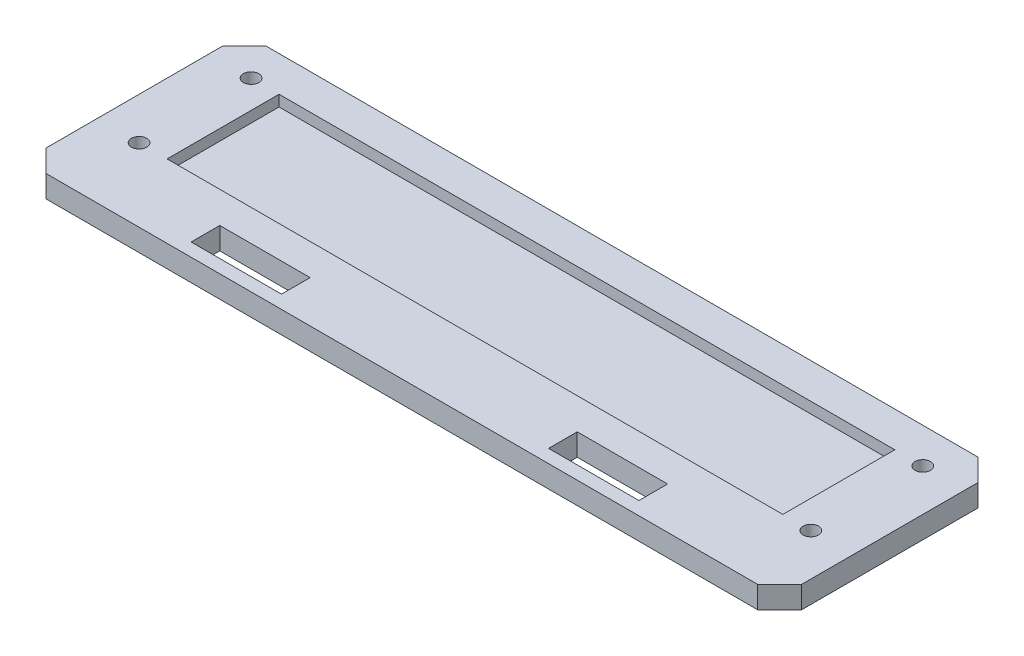
ISO-10303-21;
HEADER;
FILE_DESCRIPTION(('STEP AP214'),'2;1');
FILE_NAME('part.step','',(''),(''),'','','');
FILE_SCHEMA(('AUTOMOTIVE_DESIGN { 1 0 10303 214 1 1 1 1 }'));
ENDSEC;
DATA;
#1=APPLICATION_CONTEXT('core data for automotive mechanical design processes');
#2=APPLICATION_PROTOCOL_DEFINITION('international standard','automotive_design',2000,#1);
#3=PRODUCT_CONTEXT('',#1,'mechanical');
#4=PRODUCT('Part','Part','',(#3));
#5=PRODUCT_RELATED_PRODUCT_CATEGORY('part','',(#4));
#6=PRODUCT_DEFINITION_FORMATION('','',#4);
#7=PRODUCT_DEFINITION_CONTEXT('part definition',#1,'design');
#8=PRODUCT_DEFINITION('design','',#6,#7);
#9=PRODUCT_DEFINITION_SHAPE('','',#8);
#10=(LENGTH_UNIT() NAMED_UNIT(*) SI_UNIT(.MILLI.,.METRE.));
#11=(NAMED_UNIT(*) PLANE_ANGLE_UNIT() SI_UNIT($,.RADIAN.));
#12=(NAMED_UNIT(*) SI_UNIT($,.STERADIAN.) SOLID_ANGLE_UNIT());
#13=UNCERTAINTY_MEASURE_WITH_UNIT(LENGTH_MEASURE(1.E-05),#10,'distance_accuracy_value','');
#14=(GEOMETRIC_REPRESENTATION_CONTEXT(3) GLOBAL_UNCERTAINTY_ASSIGNED_CONTEXT((#13)) GLOBAL_UNIT_ASSIGNED_CONTEXT((#10,
#11,#12)) REPRESENTATION_CONTEXT('',''));
#15=CARTESIAN_POINT('',(0.,0.,0.));
#16=DIRECTION('',(0.,0.,1.));
#17=DIRECTION('',(1.,0.,0.));
#18=AXIS2_PLACEMENT_3D('',#15,#16,#17);
#19=CARTESIAN_POINT('',(0.,5.,0.));
#20=DIRECTION('',(0.,-1.,0.));
#21=DIRECTION('',(0.,0.,-1.));
#22=AXIS2_PLACEMENT_3D('',#19,#20,#21);
#23=PLANE('',#22);
#24=DIRECTION('',(-1.,0.,0.));
#25=VECTOR('',#24,1.);
#26=CARTESIAN_POINT('',(-30.2999999999999,5.,15.5));
#27=LINE('',#26,#25);
#28=CARTESIAN_POINT('',(-30.2999999999999,5.,15.5));
#29=VERTEX_POINT('',#28);
#30=CARTESIAN_POINT('',(-50.7999999999999,5.,15.5));
#31=VERTEX_POINT('',#30);
#32=EDGE_CURVE('E181',#29,#31,#27,.T.);
#33=ORIENTED_EDGE('',*,*,#32,.F.);
#34=DIRECTION('',(0.,0.,-1.));
#35=VECTOR('',#34,1.);
#36=CARTESIAN_POINT('',(-30.2999999999999,5.,22.));
#37=LINE('',#36,#35);
#38=CARTESIAN_POINT('',(-30.2999999999999,5.,22.));
#39=VERTEX_POINT('',#38);
#40=EDGE_CURVE('E48',#39,#29,#37,.T.);
#41=ORIENTED_EDGE('',*,*,#40,.F.);
#42=DIRECTION('',(1.,0.,0.));
#43=VECTOR('',#42,1.);
#44=CARTESIAN_POINT('',(-30.2999999999999,5.,22.));
#45=LINE('',#44,#43);
#46=CARTESIAN_POINT('',(-50.7999999999999,5.,22.));
#47=VERTEX_POINT('',#46);
#48=EDGE_CURVE('E187',#47,#39,#45,.T.);
#49=ORIENTED_EDGE('',*,*,#48,.F.);
#50=DIRECTION('',(0.,0.,1.));
#51=VECTOR('',#50,1.);
#52=CARTESIAN_POINT('',(-50.7999999999999,5.,22.));
#53=LINE('',#52,#51);
#54=EDGE_CURVE('E172',#31,#47,#53,.T.);
#55=ORIENTED_EDGE('',*,*,#54,.F.);
#56=EDGE_LOOP('',(#33,#41,#49,#55));
#57=FACE_BOUND('',#56,.T.);
#58=DIRECTION('',(-1.,0.,0.));
#59=VECTOR('',#58,1.);
#60=CARTESIAN_POINT('',(50.8000000000001,5.,15.5));
#61=LINE('',#60,#59);
#62=CARTESIAN_POINT('',(50.8000000000001,5.,15.5));
#63=VERTEX_POINT('',#62);
#64=CARTESIAN_POINT('',(30.3000000000001,5.,15.5));
#65=VERTEX_POINT('',#64);
#66=EDGE_CURVE('E198',#63,#65,#61,.T.);
#67=ORIENTED_EDGE('',*,*,#66,.F.);
#68=DIRECTION('',(0.,0.,-1.));
#69=VECTOR('',#68,1.);
#70=CARTESIAN_POINT('',(50.8000000000001,5.,22.));
#71=LINE('',#70,#69);
#72=CARTESIAN_POINT('',(50.8000000000001,5.,22.));
#73=VERTEX_POINT('',#72);
#74=EDGE_CURVE('E194',#73,#63,#71,.T.);
#75=ORIENTED_EDGE('',*,*,#74,.F.);
#76=DIRECTION('',(1.,0.,0.));
#77=VECTOR('',#76,1.);
#78=CARTESIAN_POINT('',(50.8000000000001,5.,22.));
#79=LINE('',#78,#77);
#80=CARTESIAN_POINT('',(30.3000000000001,5.,22.));
#81=VERTEX_POINT('',#80);
#82=EDGE_CURVE('E204',#81,#73,#79,.T.);
#83=ORIENTED_EDGE('',*,*,#82,.F.);
#84=DIRECTION('',(0.,0.,1.));
#85=VECTOR('',#84,1.);
#86=CARTESIAN_POINT('',(30.3000000000001,5.,22.));
#87=LINE('',#86,#85);
#88=EDGE_CURVE('E201',#65,#81,#87,.T.);
#89=ORIENTED_EDGE('',*,*,#88,.F.);
#90=EDGE_LOOP('',(#67,#75,#83,#89));
#91=FACE_BOUND('',#90,.T.);
#92=DIRECTION('',(1.,0.,0.));
#93=VECTOR('',#92,1.);
#94=CARTESIAN_POINT('',(-69.85,5.,8.39999999999999));
#95=LINE('',#94,#93);
#96=CARTESIAN_POINT('',(-69.85,5.,8.39999999999999));
#97=VERTEX_POINT('',#96);
#98=CARTESIAN_POINT('',(69.85,5.,8.39999999999999));
#99=VERTEX_POINT('',#98);
#100=EDGE_CURVE('E232',#97,#99,#95,.T.);
#101=ORIENTED_EDGE('',*,*,#100,.F.);
#102=DIRECTION('',(0.,0.,1.));
#103=VECTOR('',#102,1.);
#104=CARTESIAN_POINT('',(-69.85,5.,-17.));
#105=LINE('',#104,#103);
#106=CARTESIAN_POINT('',(-69.85,5.,-17.));
#107=VERTEX_POINT('',#106);
#108=EDGE_CURVE('E210',#107,#97,#105,.T.);
#109=ORIENTED_EDGE('',*,*,#108,.F.);
#110=DIRECTION('',(-1.,0.,0.));
#111=VECTOR('',#110,1.);
#112=CARTESIAN_POINT('',(-69.85,5.,-17.));
#113=LINE('',#112,#111);
#114=CARTESIAN_POINT('',(69.85,5.,-17.));
#115=VERTEX_POINT('',#114);
#116=EDGE_CURVE('E221',#115,#107,#113,.T.);
#117=ORIENTED_EDGE('',*,*,#116,.F.);
#118=DIRECTION('',(0.,0.,-1.));
#119=VECTOR('',#118,1.);
#120=CARTESIAN_POINT('',(69.85,5.,-17.));
#121=LINE('',#120,#119);
#122=EDGE_CURVE('E235',#99,#115,#121,.T.);
#123=ORIENTED_EDGE('',*,*,#122,.F.);
#124=EDGE_LOOP('',(#101,#109,#117,#123));
#125=FACE_BOUND('',#124,.T.);
#126=DIRECTION('',(1.,0.,0.));
#127=VECTOR('',#126,1.);
#128=CARTESIAN_POINT('',(-85.7249999999999,5.,25.));
#129=LINE('',#128,#127);
#130=CARTESIAN_POINT('',(-80.7249999999999,5.,25.));
#131=VERTEX_POINT('',#130);
#132=CARTESIAN_POINT('',(80.725,5.,25.));
#133=VERTEX_POINT('',#132);
#134=EDGE_CURVE('E283',#131,#133,#129,.T.);
#135=ORIENTED_EDGE('',*,*,#134,.T.);
#136=DIRECTION('',(-0.707106781186548,0.,0.707106781186548));
#137=VECTOR('',#136,1.);
#138=CARTESIAN_POINT('',(85.7250000000001,5.,20.));
#139=LINE('',#138,#137);
#140=CARTESIAN_POINT('',(85.7250000000001,5.,20.));
#141=VERTEX_POINT('',#140);
#142=EDGE_CURVE('E320',#133,#141,#139,.F.);
#143=ORIENTED_EDGE('',*,*,#142,.T.);
#144=DIRECTION('',(0.,0.,-1.));
#145=VECTOR('',#144,1.);
#146=CARTESIAN_POINT('',(85.7250000000001,5.,25.));
#147=LINE('',#146,#145);
#148=CARTESIAN_POINT('',(85.7250000000001,5.,-20.));
#149=VERTEX_POINT('',#148);
#150=EDGE_CURVE('E273',#141,#149,#147,.T.);
#151=ORIENTED_EDGE('',*,*,#150,.T.);
#152=DIRECTION('',(0.707106781186548,0.,0.707106781186548));
#153=VECTOR('',#152,1.);
#154=CARTESIAN_POINT('',(80.725,5.,-25.));
#155=LINE('',#154,#153);
#156=CARTESIAN_POINT('',(80.725,5.,-25.));
#157=VERTEX_POINT('',#156);
#158=EDGE_CURVE('E314',#149,#157,#155,.F.);
#159=ORIENTED_EDGE('',*,*,#158,.T.);
#160=DIRECTION('',(-1.,0.,0.));
#161=VECTOR('',#160,1.);
#162=CARTESIAN_POINT('',(-85.7249999999999,5.,-25.));
#163=LINE('',#162,#161);
#164=CARTESIAN_POINT('',(-80.7249999999999,5.,-25.));
#165=VERTEX_POINT('',#164);
#166=EDGE_CURVE('E276',#157,#165,#163,.T.);
#167=ORIENTED_EDGE('',*,*,#166,.T.);
#168=DIRECTION('',(0.707106781186548,0.,-0.707106781186548));
#169=VECTOR('',#168,1.);
#170=CARTESIAN_POINT('',(-85.7249999999999,5.,-20.));
#171=LINE('',#170,#169);
#172=CARTESIAN_POINT('',(-85.7249999999999,5.,-20.));
#173=VERTEX_POINT('',#172);
#174=EDGE_CURVE('E316',#165,#173,#171,.F.);
#175=ORIENTED_EDGE('',*,*,#174,.T.);
#176=DIRECTION('',(0.,0.,1.));
#177=VECTOR('',#176,1.);
#178=CARTESIAN_POINT('',(-85.7249999999999,5.,25.));
#179=LINE('',#178,#177);
#180=CARTESIAN_POINT('',(-85.7249999999999,5.,20.));
#181=VERTEX_POINT('',#180);
#182=EDGE_CURVE('E280',#173,#181,#179,.T.);
#183=ORIENTED_EDGE('',*,*,#182,.T.);
#184=DIRECTION('',(-0.707106781186548,0.,-0.707106781186548));
#185=VECTOR('',#184,1.);
#186=CARTESIAN_POINT('',(-80.7249999999999,5.,25.));
#187=LINE('',#186,#185);
#188=EDGE_CURVE('E318',#181,#131,#187,.F.);
#189=ORIENTED_EDGE('',*,*,#188,.T.);
#190=EDGE_LOOP('',(#135,#143,#151,#159,#167,#175,#183,#189));
#191=FACE_BOUND('',#190,.T.);
#192=CARTESIAN_POINT('',(-76.2,5.,-17.));
#193=DIRECTION('',(0.,1.,0.));
#194=DIRECTION('',(0.,0.,1.));
#195=AXIS2_PLACEMENT_3D('',#192,#193,#194);
#196=CIRCLE('',#195,1.75);
#197=CARTESIAN_POINT('',(-76.2,5.,-15.25));
#198=VERTEX_POINT('',#197);
#199=EDGE_CURVE('E267',#198,#198,#196,.T.);
#200=ORIENTED_EDGE('',*,*,#199,.F.);
#201=EDGE_LOOP('',(#200));
#202=FACE_BOUND('',#201,.T.);
#203=CARTESIAN_POINT('',(76.2,5.,-17.));
#204=DIRECTION('',(0.,1.,0.));
#205=DIRECTION('',(0.,0.,1.));
#206=AXIS2_PLACEMENT_3D('',#203,#204,#205);
#207=CIRCLE('',#206,1.75);
#208=CARTESIAN_POINT('',(76.2,5.,-15.25));
#209=VERTEX_POINT('',#208);
#210=EDGE_CURVE('E261',#209,#209,#207,.T.);
#211=ORIENTED_EDGE('',*,*,#210,.F.);
#212=EDGE_LOOP('',(#211));
#213=FACE_BOUND('',#212,.T.);
#214=CARTESIAN_POINT('',(-76.2,5.,8.39999999999999));
#215=DIRECTION('',(0.,1.,0.));
#216=DIRECTION('',(0.,0.,1.));
#217=AXIS2_PLACEMENT_3D('',#214,#215,#216);
#218=CIRCLE('',#217,1.75);
#219=CARTESIAN_POINT('',(-76.2,5.,10.15));
#220=VERTEX_POINT('',#219);
#221=EDGE_CURVE('E255',#220,#220,#218,.T.);
#222=ORIENTED_EDGE('',*,*,#221,.F.);
#223=EDGE_LOOP('',(#222));
#224=FACE_BOUND('',#223,.T.);
#225=CARTESIAN_POINT('',(76.2,5.,8.39999999999999));
#226=DIRECTION('',(0.,1.,0.));
#227=DIRECTION('',(0.,0.,1.));
#228=AXIS2_PLACEMENT_3D('',#225,#226,#227);
#229=CIRCLE('',#228,1.75);
#230=CARTESIAN_POINT('',(76.2,5.,10.15));
#231=VERTEX_POINT('',#230);
#232=EDGE_CURVE('E249',#231,#231,#229,.T.);
#233=ORIENTED_EDGE('',*,*,#232,.F.);
#234=EDGE_LOOP('',(#233));
#235=FACE_BOUND('',#234,.T.);
#236=ADVANCED_FACE('F33',(#57,#91,#125,#191,#202,#213,#224,#235),#23,.F.);
#237=CARTESIAN_POINT('',(0.,0.,0.));
#238=DIRECTION('',(0.,-1.,0.));
#239=DIRECTION('',(0.,0.,-1.));
#240=AXIS2_PLACEMENT_3D('',#237,#238,#239);
#241=PLANE('',#240);
#242=DIRECTION('',(0.,0.,1.));
#243=VECTOR('',#242,1.);
#244=CARTESIAN_POINT('',(-30.2999999999999,0.,0.));
#245=LINE('',#244,#243);
#246=CARTESIAN_POINT('',(-30.2999999999999,0.,15.5));
#247=VERTEX_POINT('',#246);
#248=CARTESIAN_POINT('',(-30.2999999999999,0.,22.));
#249=VERTEX_POINT('',#248);
#250=EDGE_CURVE('E11',#247,#249,#245,.T.);
#251=ORIENTED_EDGE('',*,*,#250,.F.);
#252=DIRECTION('',(1.,0.,0.));
#253=VECTOR('',#252,1.);
#254=CARTESIAN_POINT('',(0.,0.,15.5));
#255=LINE('',#254,#253);
#256=CARTESIAN_POINT('',(-50.7999999999999,0.,15.5));
#257=VERTEX_POINT('',#256);
#258=EDGE_CURVE('E341',#257,#247,#255,.T.);
#259=ORIENTED_EDGE('',*,*,#258,.F.);
#260=DIRECTION('',(0.,0.,-1.));
#261=VECTOR('',#260,1.);
#262=CARTESIAN_POINT('',(-50.7999999999999,0.,0.));
#263=LINE('',#262,#261);
#264=CARTESIAN_POINT('',(-50.7999999999999,0.,22.));
#265=VERTEX_POINT('',#264);
#266=EDGE_CURVE('E175',#265,#257,#263,.T.);
#267=ORIENTED_EDGE('',*,*,#266,.F.);
#268=DIRECTION('',(-1.,0.,0.));
#269=VECTOR('',#268,1.);
#270=CARTESIAN_POINT('',(0.,0.,22.));
#271=LINE('',#270,#269);
#272=EDGE_CURVE('E41',#249,#265,#271,.T.);
#273=ORIENTED_EDGE('',*,*,#272,.F.);
#274=EDGE_LOOP('',(#251,#259,#267,#273));
#275=FACE_BOUND('',#274,.T.);
#276=DIRECTION('',(0.,0.,1.));
#277=VECTOR('',#276,1.);
#278=CARTESIAN_POINT('',(50.8000000000001,0.,0.));
#279=LINE('',#278,#277);
#280=CARTESIAN_POINT('',(50.8000000000001,0.,15.5));
#281=VERTEX_POINT('',#280);
#282=CARTESIAN_POINT('',(50.8000000000001,0.,22.));
#283=VERTEX_POINT('',#282);
#284=EDGE_CURVE('E339',#281,#283,#279,.T.);
#285=ORIENTED_EDGE('',*,*,#284,.F.);
#286=DIRECTION('',(1.,0.,0.));
#287=VECTOR('',#286,1.);
#288=CARTESIAN_POINT('',(0.,0.,15.5));
#289=LINE('',#288,#287);
#290=CARTESIAN_POINT('',(30.3000000000001,0.,15.5));
#291=VERTEX_POINT('',#290);
#292=EDGE_CURVE('E332',#291,#281,#289,.T.);
#293=ORIENTED_EDGE('',*,*,#292,.F.);
#294=DIRECTION('',(0.,0.,-1.));
#295=VECTOR('',#294,1.);
#296=CARTESIAN_POINT('',(30.3000000000001,0.,0.));
#297=LINE('',#296,#295);
#298=CARTESIAN_POINT('',(30.3000000000001,0.,22.));
#299=VERTEX_POINT('',#298);
#300=EDGE_CURVE('E334',#299,#291,#297,.T.);
#301=ORIENTED_EDGE('',*,*,#300,.F.);
#302=DIRECTION('',(-1.,0.,0.));
#303=VECTOR('',#302,1.);
#304=CARTESIAN_POINT('',(0.,0.,22.));
#305=LINE('',#304,#303);
#306=EDGE_CURVE('E337',#283,#299,#305,.T.);
#307=ORIENTED_EDGE('',*,*,#306,.F.);
#308=EDGE_LOOP('',(#285,#293,#301,#307));
#309=FACE_BOUND('',#308,.T.);
#310=CARTESIAN_POINT('',(-76.2,0.,8.39999999999999));
#311=DIRECTION('',(0.,1.,0.));
#312=DIRECTION('',(0.,0.,1.));
#313=AXIS2_PLACEMENT_3D('',#310,#311,#312);
#314=CIRCLE('',#313,1.75);
#315=CARTESIAN_POINT('',(-76.2,0.,10.15));
#316=VERTEX_POINT('',#315);
#317=EDGE_CURVE('E252',#316,#316,#314,.T.);
#318=ORIENTED_EDGE('',*,*,#317,.T.);
#319=EDGE_LOOP('',(#318));
#320=FACE_BOUND('',#319,.T.);
#321=CARTESIAN_POINT('',(-76.2,0.,-17.));
#322=DIRECTION('',(0.,1.,0.));
#323=DIRECTION('',(0.,0.,1.));
#324=AXIS2_PLACEMENT_3D('',#321,#322,#323);
#325=CIRCLE('',#324,1.75);
#326=CARTESIAN_POINT('',(-76.2,0.,-15.25));
#327=VERTEX_POINT('',#326);
#328=EDGE_CURVE('E264',#327,#327,#325,.T.);
#329=ORIENTED_EDGE('',*,*,#328,.T.);
#330=EDGE_LOOP('',(#329));
#331=FACE_BOUND('',#330,.T.);
#332=DIRECTION('',(0.,0.,-1.));
#333=VECTOR('',#332,1.);
#334=CARTESIAN_POINT('',(85.7250000000001,0.,25.));
#335=LINE('',#334,#333);
#336=CARTESIAN_POINT('',(85.7250000000001,0.,20.));
#337=VERTEX_POINT('',#336);
#338=CARTESIAN_POINT('',(85.7250000000001,0.,-20.));
#339=VERTEX_POINT('',#338);
#340=EDGE_CURVE('E270',#337,#339,#335,.T.);
#341=ORIENTED_EDGE('',*,*,#340,.F.);
#342=DIRECTION('',(0.707106781186548,0.,-0.707106781186548));
#343=VECTOR('',#342,1.);
#344=CARTESIAN_POINT('',(52.8625,0.,52.8625));
#345=LINE('',#344,#343);
#346=CARTESIAN_POINT('',(80.725,0.,25.));
#347=VERTEX_POINT('',#346);
#348=EDGE_CURVE('E307',#337,#347,#345,.F.);
#349=ORIENTED_EDGE('',*,*,#348,.T.);
#350=DIRECTION('',(1.,0.,0.));
#351=VECTOR('',#350,1.);
#352=CARTESIAN_POINT('',(-85.7249999999999,0.,25.));
#353=LINE('',#352,#351);
#354=CARTESIAN_POINT('',(-80.7249999999999,0.,25.));
#355=VERTEX_POINT('',#354);
#356=EDGE_CURVE('E277',#355,#347,#353,.T.);
#357=ORIENTED_EDGE('',*,*,#356,.F.);
#358=DIRECTION('',(0.707106781186548,0.,0.707106781186548));
#359=VECTOR('',#358,1.);
#360=CARTESIAN_POINT('',(-52.8625,0.,52.8625));
#361=LINE('',#360,#359);
#362=CARTESIAN_POINT('',(-85.7249999999999,0.,20.));
#363=VERTEX_POINT('',#362);
#364=EDGE_CURVE('E305',#355,#363,#361,.F.);
#365=ORIENTED_EDGE('',*,*,#364,.T.);
#366=DIRECTION('',(0.,0.,1.));
#367=VECTOR('',#366,1.);
#368=CARTESIAN_POINT('',(-85.7249999999999,0.,25.));
#369=LINE('',#368,#367);
#370=CARTESIAN_POINT('',(-85.7249999999999,0.,-20.));
#371=VERTEX_POINT('',#370);
#372=EDGE_CURVE('E292',#371,#363,#369,.T.);
#373=ORIENTED_EDGE('',*,*,#372,.F.);
#374=DIRECTION('',(-0.707106781186548,0.,0.707106781186548));
#375=VECTOR('',#374,1.);
#376=CARTESIAN_POINT('',(-52.8625,0.,-52.8625));
#377=LINE('',#376,#375);
#378=CARTESIAN_POINT('',(-80.7249999999999,0.,-25.));
#379=VERTEX_POINT('',#378);
#380=EDGE_CURVE('E303',#371,#379,#377,.F.);
#381=ORIENTED_EDGE('',*,*,#380,.T.);
#382=DIRECTION('',(-1.,0.,0.));
#383=VECTOR('',#382,1.);
#384=CARTESIAN_POINT('',(-85.7249999999999,0.,-25.));
#385=LINE('',#384,#383);
#386=CARTESIAN_POINT('',(80.725,0.,-25.));
#387=VERTEX_POINT('',#386);
#388=EDGE_CURVE('E289',#387,#379,#385,.T.);
#389=ORIENTED_EDGE('',*,*,#388,.F.);
#390=DIRECTION('',(-0.707106781186548,0.,-0.707106781186548));
#391=VECTOR('',#390,1.);
#392=CARTESIAN_POINT('',(52.8625,0.,-52.8625));
#393=LINE('',#392,#391);
#394=EDGE_CURVE('E301',#387,#339,#393,.F.);
#395=ORIENTED_EDGE('',*,*,#394,.T.);
#396=EDGE_LOOP('',(#341,#349,#357,#365,#373,#381,#389,#395));
#397=FACE_BOUND('',#396,.T.);
#398=CARTESIAN_POINT('',(76.2,0.,-17.));
#399=DIRECTION('',(0.,1.,0.));
#400=DIRECTION('',(0.,0.,1.));
#401=AXIS2_PLACEMENT_3D('',#398,#399,#400);
#402=CIRCLE('',#401,1.75);
#403=CARTESIAN_POINT('',(76.2,0.,-15.25));
#404=VERTEX_POINT('',#403);
#405=EDGE_CURVE('E258',#404,#404,#402,.T.);
#406=ORIENTED_EDGE('',*,*,#405,.T.);
#407=EDGE_LOOP('',(#406));
#408=FACE_BOUND('',#407,.T.);
#409=CARTESIAN_POINT('',(76.2,0.,8.39999999999999));
#410=DIRECTION('',(0.,1.,0.));
#411=DIRECTION('',(0.,0.,1.));
#412=AXIS2_PLACEMENT_3D('',#409,#410,#411);
#413=CIRCLE('',#412,1.75);
#414=CARTESIAN_POINT('',(76.2,0.,10.15));
#415=VERTEX_POINT('',#414);
#416=EDGE_CURVE('E242',#415,#415,#413,.T.);
#417=ORIENTED_EDGE('',*,*,#416,.T.);
#418=EDGE_LOOP('',(#417));
#419=FACE_BOUND('',#418,.T.);
#420=ADVANCED_FACE('F349',(#275,#309,#320,#331,#397,#408,#419),#241,.T.);
#421=CARTESIAN_POINT('',(85.7250000000001,5.,25.));
#422=DIRECTION('',(-1.,0.,0.));
#423=DIRECTION('',(0.,0.,1.));
#424=AXIS2_PLACEMENT_3D('',#421,#422,#423);
#425=PLANE('',#424);
#426=ORIENTED_EDGE('',*,*,#150,.F.);
#427=DIRECTION('',(0.,-1.,0.));
#428=VECTOR('',#427,1.);
#429=CARTESIAN_POINT('',(85.7250000000001,5.,20.));
#430=LINE('',#429,#428);
#431=EDGE_CURVE('E298',#141,#337,#430,.T.);
#432=ORIENTED_EDGE('',*,*,#431,.T.);
#433=ORIENTED_EDGE('',*,*,#340,.T.);
#434=DIRECTION('',(0.,1.,0.));
#435=VECTOR('',#434,1.);
#436=CARTESIAN_POINT('',(85.7250000000001,5.,-20.));
#437=LINE('',#436,#435);
#438=EDGE_CURVE('E286',#339,#149,#437,.T.);
#439=ORIENTED_EDGE('',*,*,#438,.T.);
#440=EDGE_LOOP('',(#426,#432,#433,#439));
#441=FACE_BOUND('',#440,.T.);
#442=ADVANCED_FACE('F370',(#441),#425,.F.);
#443=CARTESIAN_POINT('',(-85.7249999999999,5.,-25.));
#444=DIRECTION('',(0.,0.,1.));
#445=DIRECTION('',(1.,0.,0.));
#446=AXIS2_PLACEMENT_3D('',#443,#444,#445);
#447=PLANE('',#446);
#448=ORIENTED_EDGE('',*,*,#388,.T.);
#449=DIRECTION('',(0.,1.,0.));
#450=VECTOR('',#449,1.);
#451=CARTESIAN_POINT('',(-80.7249999999999,5.,-25.));
#452=LINE('',#451,#450);
#453=EDGE_CURVE('E330',#379,#165,#452,.T.);
#454=ORIENTED_EDGE('',*,*,#453,.T.);
#455=ORIENTED_EDGE('',*,*,#166,.F.);
#456=DIRECTION('',(0.,-1.,0.));
#457=VECTOR('',#456,1.);
#458=CARTESIAN_POINT('',(80.725,5.,-25.));
#459=LINE('',#458,#457);
#460=EDGE_CURVE('E327',#157,#387,#459,.T.);
#461=ORIENTED_EDGE('',*,*,#460,.T.);
#462=EDGE_LOOP('',(#448,#454,#455,#461));
#463=FACE_BOUND('',#462,.T.);
#464=ADVANCED_FACE('F383',(#463),#447,.F.);
#465=CARTESIAN_POINT('',(-85.7249999999999,5.,25.));
#466=DIRECTION('',(1.,0.,0.));
#467=DIRECTION('',(0.,0.,-1.));
#468=AXIS2_PLACEMENT_3D('',#465,#466,#467);
#469=PLANE('',#468);
#470=ORIENTED_EDGE('',*,*,#372,.T.);
#471=DIRECTION('',(0.,1.,0.));
#472=VECTOR('',#471,1.);
#473=CARTESIAN_POINT('',(-85.7249999999999,5.,20.));
#474=LINE('',#473,#472);
#475=EDGE_CURVE('E325',#363,#181,#474,.T.);
#476=ORIENTED_EDGE('',*,*,#475,.T.);
#477=ORIENTED_EDGE('',*,*,#182,.F.);
#478=DIRECTION('',(0.,-1.,0.));
#479=VECTOR('',#478,1.);
#480=CARTESIAN_POINT('',(-85.7249999999999,5.,-20.));
#481=LINE('',#480,#479);
#482=EDGE_CURVE('E322',#173,#371,#481,.T.);
#483=ORIENTED_EDGE('',*,*,#482,.T.);
#484=EDGE_LOOP('',(#470,#476,#477,#483));
#485=FACE_BOUND('',#484,.T.);
#486=ADVANCED_FACE('F379',(#485),#469,.F.);
#487=CARTESIAN_POINT('',(-85.7249999999999,5.,25.));
#488=DIRECTION('',(0.,0.,-1.));
#489=DIRECTION('',(-1.,0.,0.));
#490=AXIS2_PLACEMENT_3D('',#487,#488,#489);
#491=PLANE('',#490);
#492=ORIENTED_EDGE('',*,*,#356,.T.);
#493=DIRECTION('',(0.,1.,0.));
#494=VECTOR('',#493,1.);
#495=CARTESIAN_POINT('',(80.725,5.,25.));
#496=LINE('',#495,#494);
#497=EDGE_CURVE('E312',#347,#133,#496,.T.);
#498=ORIENTED_EDGE('',*,*,#497,.T.);
#499=ORIENTED_EDGE('',*,*,#134,.F.);
#500=DIRECTION('',(0.,-1.,0.));
#501=VECTOR('',#500,1.);
#502=CARTESIAN_POINT('',(-80.7249999999999,5.,25.));
#503=LINE('',#502,#501);
#504=EDGE_CURVE('E309',#131,#355,#503,.T.);
#505=ORIENTED_EDGE('',*,*,#504,.T.);
#506=EDGE_LOOP('',(#492,#498,#499,#505));
#507=FACE_BOUND('',#506,.T.);
#508=ADVANCED_FACE('F376',(#507),#491,.F.);
#509=CARTESIAN_POINT('',(-76.2,5.,-17.));
#510=DIRECTION('',(0.,-1.,0.));
#511=DIRECTION('',(0.,0.,-1.));
#512=AXIS2_PLACEMENT_3D('',#509,#510,#511);
#513=CYLINDRICAL_SURFACE('',#512,1.75);
#514=ORIENTED_EDGE('',*,*,#199,.T.);
#515=EDGE_LOOP('',(#514));
#516=FACE_BOUND('',#515,.T.);
#517=ORIENTED_EDGE('',*,*,#328,.F.);
#518=EDGE_LOOP('',(#517));
#519=FACE_BOUND('',#518,.T.);
#520=ADVANCED_FACE('F373',(#516,#519),#513,.F.);
#521=CARTESIAN_POINT('',(76.2,5.,-17.));
#522=DIRECTION('',(0.,-1.,0.));
#523=DIRECTION('',(0.,0.,-1.));
#524=AXIS2_PLACEMENT_3D('',#521,#522,#523);
#525=CYLINDRICAL_SURFACE('',#524,1.75);
#526=ORIENTED_EDGE('',*,*,#210,.T.);
#527=EDGE_LOOP('',(#526));
#528=FACE_BOUND('',#527,.T.);
#529=ORIENTED_EDGE('',*,*,#405,.F.);
#530=EDGE_LOOP('',(#529));
#531=FACE_BOUND('',#530,.T.);
#532=ADVANCED_FACE('F442',(#528,#531),#525,.F.);
#533=CARTESIAN_POINT('',(-76.2,5.,8.39999999999999));
#534=DIRECTION('',(0.,-1.,0.));
#535=DIRECTION('',(0.,0.,-1.));
#536=AXIS2_PLACEMENT_3D('',#533,#534,#535);
#537=CYLINDRICAL_SURFACE('',#536,1.75);
#538=ORIENTED_EDGE('',*,*,#221,.T.);
#539=EDGE_LOOP('',(#538));
#540=FACE_BOUND('',#539,.T.);
#541=ORIENTED_EDGE('',*,*,#317,.F.);
#542=EDGE_LOOP('',(#541));
#543=FACE_BOUND('',#542,.T.);
#544=ADVANCED_FACE('F436',(#540,#543),#537,.F.);
#545=CARTESIAN_POINT('',(76.2,5.,8.39999999999999));
#546=DIRECTION('',(0.,-1.,0.));
#547=DIRECTION('',(0.,0.,-1.));
#548=AXIS2_PLACEMENT_3D('',#545,#546,#547);
#549=CYLINDRICAL_SURFACE('',#548,1.75);
#550=ORIENTED_EDGE('',*,*,#232,.T.);
#551=EDGE_LOOP('',(#550));
#552=FACE_BOUND('',#551,.T.);
#553=ORIENTED_EDGE('',*,*,#416,.F.);
#554=EDGE_LOOP('',(#553));
#555=FACE_BOUND('',#554,.T.);
#556=ADVANCED_FACE('F395',(#552,#555),#549,.F.);
#557=CARTESIAN_POINT('',(85.7250000000001,5.,20.));
#558=DIRECTION('',(-0.707106781186547,0.,-0.707106781186547));
#559=DIRECTION('',(0.,-1.,0.));
#560=AXIS2_PLACEMENT_3D('',#557,#558,#559);
#561=PLANE('',#560);
#562=ORIENTED_EDGE('',*,*,#142,.F.);
#563=ORIENTED_EDGE('',*,*,#497,.F.);
#564=ORIENTED_EDGE('',*,*,#348,.F.);
#565=ORIENTED_EDGE('',*,*,#431,.F.);
#566=EDGE_LOOP('',(#562,#563,#564,#565));
#567=FACE_BOUND('',#566,.T.);
#568=ADVANCED_FACE('F391',(#567),#561,.F.);
#569=CARTESIAN_POINT('',(-80.7249999999999,5.,25.));
#570=DIRECTION('',(0.707106781186547,0.,-0.707106781186547));
#571=DIRECTION('',(0.,-1.,0.));
#572=AXIS2_PLACEMENT_3D('',#569,#570,#571);
#573=PLANE('',#572);
#574=ORIENTED_EDGE('',*,*,#188,.F.);
#575=ORIENTED_EDGE('',*,*,#475,.F.);
#576=ORIENTED_EDGE('',*,*,#364,.F.);
#577=ORIENTED_EDGE('',*,*,#504,.F.);
#578=EDGE_LOOP('',(#574,#575,#576,#577));
#579=FACE_BOUND('',#578,.T.);
#580=ADVANCED_FACE('F394',(#579),#573,.F.);
#581=CARTESIAN_POINT('',(-85.7249999999999,5.,-20.));
#582=DIRECTION('',(0.707106781186547,0.,0.707106781186547));
#583=DIRECTION('',(0.,-1.,0.));
#584=AXIS2_PLACEMENT_3D('',#581,#582,#583);
#585=PLANE('',#584);
#586=ORIENTED_EDGE('',*,*,#174,.F.);
#587=ORIENTED_EDGE('',*,*,#453,.F.);
#588=ORIENTED_EDGE('',*,*,#380,.F.);
#589=ORIENTED_EDGE('',*,*,#482,.F.);
#590=EDGE_LOOP('',(#586,#587,#588,#589));
#591=FACE_BOUND('',#590,.T.);
#592=ADVANCED_FACE('F398',(#591),#585,.F.);
#593=CARTESIAN_POINT('',(80.725,5.,-25.));
#594=DIRECTION('',(-0.707106781186547,0.,0.707106781186547));
#595=DIRECTION('',(0.,-1.,0.));
#596=AXIS2_PLACEMENT_3D('',#593,#594,#595);
#597=PLANE('',#596);
#598=ORIENTED_EDGE('',*,*,#158,.F.);
#599=ORIENTED_EDGE('',*,*,#438,.F.);
#600=ORIENTED_EDGE('',*,*,#394,.F.);
#601=ORIENTED_EDGE('',*,*,#460,.F.);
#602=EDGE_LOOP('',(#598,#599,#600,#601));
#603=FACE_BOUND('',#602,.T.);
#604=ADVANCED_FACE('F35',(#603),#597,.F.);
#605=CARTESIAN_POINT('',(-69.85,2.5,-17.));
#606=DIRECTION('',(-1.,0.,0.));
#607=DIRECTION('',(0.,0.,1.));
#608=AXIS2_PLACEMENT_3D('',#605,#606,#607);
#609=PLANE('',#608);
#610=ORIENTED_EDGE('',*,*,#108,.T.);
#611=DIRECTION('',(0.,1.,0.));
#612=VECTOR('',#611,1.);
#613=CARTESIAN_POINT('',(-69.85,2.5,8.39999999999999));
#614=LINE('',#613,#612);
#615=CARTESIAN_POINT('',(-69.85,2.5,8.39999999999999));
#616=VERTEX_POINT('',#615);
#617=EDGE_CURVE('E230',#616,#97,#614,.T.);
#618=ORIENTED_EDGE('',*,*,#617,.F.);
#619=DIRECTION('',(0.,0.,1.));
#620=VECTOR('',#619,1.);
#621=CARTESIAN_POINT('',(-69.85,2.5,-17.));
#622=LINE('',#621,#620);
#623=CARTESIAN_POINT('',(-69.85,2.5,-17.));
#624=VERTEX_POINT('',#623);
#625=EDGE_CURVE('E217',#624,#616,#622,.T.);
#626=ORIENTED_EDGE('',*,*,#625,.F.);
#627=DIRECTION('',(0.,1.,0.));
#628=VECTOR('',#627,1.);
#629=CARTESIAN_POINT('',(-69.85,2.5,-17.));
#630=LINE('',#629,#628);
#631=EDGE_CURVE('E240',#624,#107,#630,.T.);
#632=ORIENTED_EDGE('',*,*,#631,.T.);
#633=EDGE_LOOP('',(#610,#618,#626,#632));
#634=FACE_BOUND('',#633,.T.);
#635=ADVANCED_FACE('F405',(#634),#609,.F.);
#636=CARTESIAN_POINT('',(-69.85,2.5,-17.));
#637=DIRECTION('',(0.,0.,-1.));
#638=DIRECTION('',(-1.,0.,0.));
#639=AXIS2_PLACEMENT_3D('',#636,#637,#638);
#640=PLANE('',#639);
#641=ORIENTED_EDGE('',*,*,#116,.T.);
#642=ORIENTED_EDGE('',*,*,#631,.F.);
#643=DIRECTION('',(-1.,0.,0.));
#644=VECTOR('',#643,1.);
#645=CARTESIAN_POINT('',(-69.85,2.5,-17.));
#646=LINE('',#645,#644);
#647=CARTESIAN_POINT('',(69.85,2.5,-17.));
#648=VERTEX_POINT('',#647);
#649=EDGE_CURVE('E227',#648,#624,#646,.T.);
#650=ORIENTED_EDGE('',*,*,#649,.F.);
#651=DIRECTION('',(0.,1.,0.));
#652=VECTOR('',#651,1.);
#653=CARTESIAN_POINT('',(69.85,2.5,-17.));
#654=LINE('',#653,#652);
#655=EDGE_CURVE('E243',#648,#115,#654,.T.);
#656=ORIENTED_EDGE('',*,*,#655,.T.);
#657=EDGE_LOOP('',(#641,#642,#650,#656));
#658=FACE_BOUND('',#657,.T.);
#659=ADVANCED_FACE('F563',(#658),#640,.F.);
#660=CARTESIAN_POINT('',(69.85,2.5,-17.));
#661=DIRECTION('',(1.,0.,0.));
#662=DIRECTION('',(0.,0.,-1.));
#663=AXIS2_PLACEMENT_3D('',#660,#661,#662);
#664=PLANE('',#663);
#665=ORIENTED_EDGE('',*,*,#122,.T.);
#666=ORIENTED_EDGE('',*,*,#655,.F.);
#667=DIRECTION('',(0.,0.,-1.));
#668=VECTOR('',#667,1.);
#669=CARTESIAN_POINT('',(69.85,2.5,-17.));
#670=LINE('',#669,#668);
#671=CARTESIAN_POINT('',(69.85,2.5,8.39999999999999));
#672=VERTEX_POINT('',#671);
#673=EDGE_CURVE('E224',#672,#648,#670,.T.);
#674=ORIENTED_EDGE('',*,*,#673,.F.);
#675=DIRECTION('',(0.,1.,0.));
#676=VECTOR('',#675,1.);
#677=CARTESIAN_POINT('',(69.85,2.5,8.39999999999999));
#678=LINE('',#677,#676);
#679=EDGE_CURVE('E245',#672,#99,#678,.T.);
#680=ORIENTED_EDGE('',*,*,#679,.T.);
#681=EDGE_LOOP('',(#665,#666,#674,#680));
#682=FACE_BOUND('',#681,.T.);
#683=ADVANCED_FACE('F566',(#682),#664,.F.);
#684=CARTESIAN_POINT('',(-69.85,2.5,8.39999999999999));
#685=DIRECTION('',(0.,0.,1.));
#686=DIRECTION('',(1.,0.,0.));
#687=AXIS2_PLACEMENT_3D('',#684,#685,#686);
#688=PLANE('',#687);
#689=ORIENTED_EDGE('',*,*,#100,.T.);
#690=ORIENTED_EDGE('',*,*,#679,.F.);
#691=DIRECTION('',(1.,0.,0.));
#692=VECTOR('',#691,1.);
#693=CARTESIAN_POINT('',(-69.85,2.5,8.39999999999999));
#694=LINE('',#693,#692);
#695=EDGE_CURVE('E220',#616,#672,#694,.T.);
#696=ORIENTED_EDGE('',*,*,#695,.F.);
#697=ORIENTED_EDGE('',*,*,#617,.T.);
#698=EDGE_LOOP('',(#689,#690,#696,#697));
#699=FACE_BOUND('',#698,.T.);
#700=ADVANCED_FACE('F561',(#699),#688,.F.);
#701=CARTESIAN_POINT('',(0.,2.5,0.));
#702=DIRECTION('',(0.,1.,0.));
#703=DIRECTION('',(0.,0.,1.));
#704=AXIS2_PLACEMENT_3D('',#701,#702,#703);
#705=PLANE('',#704);
#706=ORIENTED_EDGE('',*,*,#625,.T.);
#707=ORIENTED_EDGE('',*,*,#695,.T.);
#708=ORIENTED_EDGE('',*,*,#673,.T.);
#709=ORIENTED_EDGE('',*,*,#649,.T.);
#710=EDGE_LOOP('',(#706,#707,#708,#709));
#711=FACE_BOUND('',#710,.T.);
#712=ADVANCED_FACE('F504',(#711),#705,.T.);
#713=CARTESIAN_POINT('',(50.8000000000001,-10.,22.));
#714=DIRECTION('',(1.,0.,0.));
#715=DIRECTION('',(0.,0.,-1.));
#716=AXIS2_PLACEMENT_3D('',#713,#714,#715);
#717=PLANE('',#716);
#718=ORIENTED_EDGE('',*,*,#284,.T.);
#719=DIRECTION('',(0.,1.,0.));
#720=VECTOR('',#719,1.);
#721=CARTESIAN_POINT('',(50.8000000000001,-10.,22.));
#722=LINE('',#721,#720);
#723=EDGE_CURVE('E208',#283,#73,#722,.T.);
#724=ORIENTED_EDGE('',*,*,#723,.T.);
#725=ORIENTED_EDGE('',*,*,#74,.T.);
#726=DIRECTION('',(0.,1.,0.));
#727=VECTOR('',#726,1.);
#728=CARTESIAN_POINT('',(50.8000000000001,-10.,15.5));
#729=LINE('',#728,#727);
#730=EDGE_CURVE('E207',#281,#63,#729,.T.);
#731=ORIENTED_EDGE('',*,*,#730,.F.);
#732=EDGE_LOOP('',(#718,#724,#725,#731));
#733=FACE_BOUND('',#732,.T.);
#734=ADVANCED_FACE('F498',(#733),#717,.F.);
#735=CARTESIAN_POINT('',(50.8000000000001,-10.,22.));
#736=DIRECTION('',(0.,0.,1.));
#737=DIRECTION('',(1.,0.,0.));
#738=AXIS2_PLACEMENT_3D('',#735,#736,#737);
#739=PLANE('',#738);
#740=ORIENTED_EDGE('',*,*,#306,.T.);
#741=DIRECTION('',(0.,1.,0.));
#742=VECTOR('',#741,1.);
#743=CARTESIAN_POINT('',(30.3000000000001,-10.,22.));
#744=LINE('',#743,#742);
#745=EDGE_CURVE('E211',#299,#81,#744,.T.);
#746=ORIENTED_EDGE('',*,*,#745,.T.);
#747=ORIENTED_EDGE('',*,*,#82,.T.);
#748=ORIENTED_EDGE('',*,*,#723,.F.);
#749=EDGE_LOOP('',(#740,#746,#747,#748));
#750=FACE_BOUND('',#749,.T.);
#751=ADVANCED_FACE('F503',(#750),#739,.F.);
#752=CARTESIAN_POINT('',(30.3000000000001,-10.,22.));
#753=DIRECTION('',(-1.,0.,0.));
#754=DIRECTION('',(0.,0.,1.));
#755=AXIS2_PLACEMENT_3D('',#752,#753,#754);
#756=PLANE('',#755);
#757=ORIENTED_EDGE('',*,*,#300,.T.);
#758=DIRECTION('',(0.,1.,0.));
#759=VECTOR('',#758,1.);
#760=CARTESIAN_POINT('',(30.3000000000001,-10.,15.5));
#761=LINE('',#760,#759);
#762=EDGE_CURVE('E213',#291,#65,#761,.T.);
#763=ORIENTED_EDGE('',*,*,#762,.T.);
#764=ORIENTED_EDGE('',*,*,#88,.T.);
#765=ORIENTED_EDGE('',*,*,#745,.F.);
#766=EDGE_LOOP('',(#757,#763,#764,#765));
#767=FACE_BOUND('',#766,.T.);
#768=ADVANCED_FACE('F360',(#767),#756,.F.);
#769=CARTESIAN_POINT('',(50.8000000000001,-10.,15.5));
#770=DIRECTION('',(0.,0.,-1.));
#771=DIRECTION('',(-1.,0.,0.));
#772=AXIS2_PLACEMENT_3D('',#769,#770,#771);
#773=PLANE('',#772);
#774=ORIENTED_EDGE('',*,*,#292,.T.);
#775=ORIENTED_EDGE('',*,*,#730,.T.);
#776=ORIENTED_EDGE('',*,*,#66,.T.);
#777=ORIENTED_EDGE('',*,*,#762,.F.);
#778=EDGE_LOOP('',(#774,#775,#776,#777));
#779=FACE_BOUND('',#778,.T.);
#780=ADVANCED_FACE('F353',(#779),#773,.F.);
#781=CARTESIAN_POINT('',(-30.2999999999999,-10.,22.));
#782=DIRECTION('',(1.,0.,0.));
#783=DIRECTION('',(0.,0.,-1.));
#784=AXIS2_PLACEMENT_3D('',#781,#782,#783);
#785=PLANE('',#784);
#786=ORIENTED_EDGE('',*,*,#250,.T.);
#787=DIRECTION('',(0.,1.,0.));
#788=VECTOR('',#787,1.);
#789=CARTESIAN_POINT('',(-30.2999999999999,-10.,22.));
#790=LINE('',#789,#788);
#791=EDGE_CURVE('E192',#249,#39,#790,.T.);
#792=ORIENTED_EDGE('',*,*,#791,.T.);
#793=ORIENTED_EDGE('',*,*,#40,.T.);
#794=DIRECTION('',(0.,1.,0.));
#795=VECTOR('',#794,1.);
#796=CARTESIAN_POINT('',(-30.2999999999999,-10.,15.5));
#797=LINE('',#796,#795);
#798=EDGE_CURVE('E178',#247,#29,#797,.T.);
#799=ORIENTED_EDGE('',*,*,#798,.F.);
#800=EDGE_LOOP('',(#786,#792,#793,#799));
#801=FACE_BOUND('',#800,.T.);
#802=ADVANCED_FACE('F351',(#801),#785,.F.);
#803=CARTESIAN_POINT('',(-30.2999999999999,-10.,22.));
#804=DIRECTION('',(0.,0.,1.));
#805=DIRECTION('',(1.,0.,0.));
#806=AXIS2_PLACEMENT_3D('',#803,#804,#805);
#807=PLANE('',#806);
#808=ORIENTED_EDGE('',*,*,#272,.T.);
#809=DIRECTION('',(0.,1.,0.));
#810=VECTOR('',#809,1.);
#811=CARTESIAN_POINT('',(-50.7999999999999,-10.,22.));
#812=LINE('',#811,#810);
#813=EDGE_CURVE('E177',#265,#47,#812,.T.);
#814=ORIENTED_EDGE('',*,*,#813,.T.);
#815=ORIENTED_EDGE('',*,*,#48,.T.);
#816=ORIENTED_EDGE('',*,*,#791,.F.);
#817=EDGE_LOOP('',(#808,#814,#815,#816));
#818=FACE_BOUND('',#817,.T.);
#819=ADVANCED_FACE('F346',(#818),#807,.F.);
#820=CARTESIAN_POINT('',(-50.7999999999999,-10.,22.));
#821=DIRECTION('',(-1.,0.,0.));
#822=DIRECTION('',(0.,0.,1.));
#823=AXIS2_PLACEMENT_3D('',#820,#821,#822);
#824=PLANE('',#823);
#825=ORIENTED_EDGE('',*,*,#266,.T.);
#826=DIRECTION('',(0.,1.,0.));
#827=VECTOR('',#826,1.);
#828=CARTESIAN_POINT('',(-50.7999999999999,-10.,15.5));
#829=LINE('',#828,#827);
#830=EDGE_CURVE('E56',#257,#31,#829,.T.);
#831=ORIENTED_EDGE('',*,*,#830,.T.);
#832=ORIENTED_EDGE('',*,*,#54,.T.);
#833=ORIENTED_EDGE('',*,*,#813,.F.);
#834=EDGE_LOOP('',(#825,#831,#832,#833));
#835=FACE_BOUND('',#834,.T.);
#836=ADVANCED_FACE('F169',(#835),#824,.F.);
#837=CARTESIAN_POINT('',(-30.2999999999999,-10.,15.5));
#838=DIRECTION('',(0.,0.,-1.));
#839=DIRECTION('',(-1.,0.,0.));
#840=AXIS2_PLACEMENT_3D('',#837,#838,#839);
#841=PLANE('',#840);
#842=ORIENTED_EDGE('',*,*,#258,.T.);
#843=ORIENTED_EDGE('',*,*,#798,.T.);
#844=ORIENTED_EDGE('',*,*,#32,.T.);
#845=ORIENTED_EDGE('',*,*,#830,.F.);
#846=EDGE_LOOP('',(#842,#843,#844,#845));
#847=FACE_BOUND('',#846,.T.);
#848=ADVANCED_FACE('F182',(#847),#841,.F.);
#849=CLOSED_SHELL('',(#236,#420,#442,#464,#486,#508,#520,#532,#544,#556,#568,#580,#592,#604,
#635,#659,#683,#700,#712,#734,#751,#768,#780,#802,#819,#836,#848));
#850=MANIFOLD_SOLID_BREP('B2',#849);
#851=ADVANCED_BREP_SHAPE_REPRESENTATION('',(#18,#850),#14);
#852=SHAPE_DEFINITION_REPRESENTATION(#9,#851);
ENDSEC;
END-ISO-10303-21;
